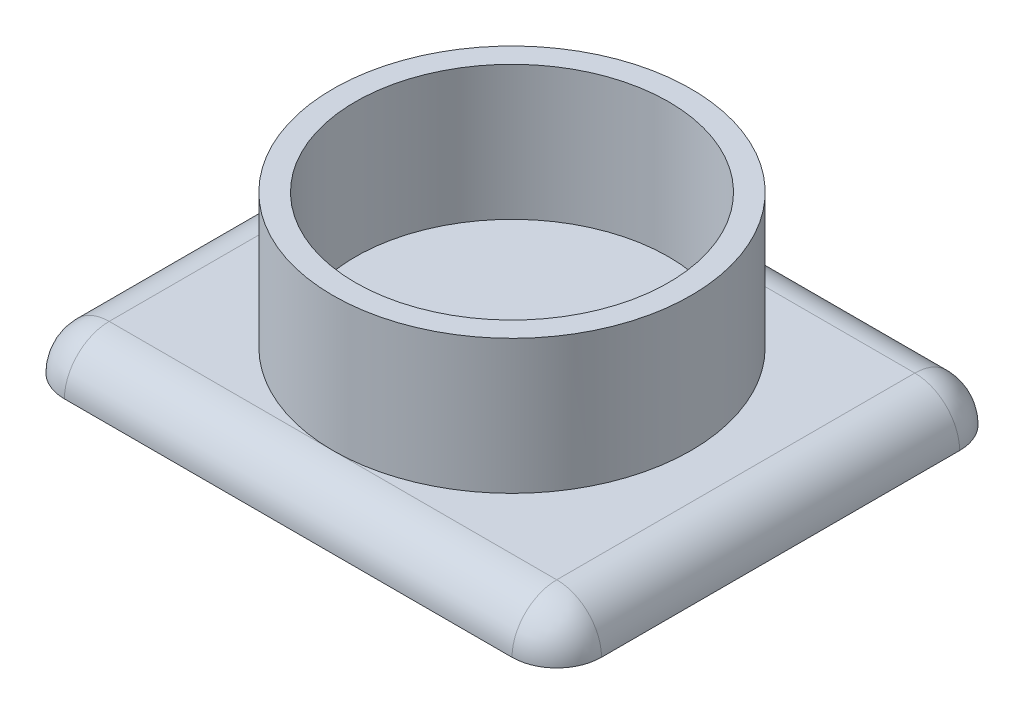
ISO-10303-21;
HEADER;
FILE_DESCRIPTION(('STEP AP214'),'2;1');
FILE_NAME('part.step','',(''),(''),'','','');
FILE_SCHEMA(('AUTOMOTIVE_DESIGN { 1 0 10303 214 1 1 1 1 }'));
ENDSEC;
DATA;
#1=APPLICATION_CONTEXT('core data for automotive mechanical design processes');
#2=APPLICATION_PROTOCOL_DEFINITION('international standard','automotive_design',2000,#1);
#3=PRODUCT_CONTEXT('',#1,'mechanical');
#4=PRODUCT('Part','Part','',(#3));
#5=PRODUCT_RELATED_PRODUCT_CATEGORY('part','',(#4));
#6=PRODUCT_DEFINITION_FORMATION('','',#4);
#7=PRODUCT_DEFINITION_CONTEXT('part definition',#1,'design');
#8=PRODUCT_DEFINITION('design','',#6,#7);
#9=PRODUCT_DEFINITION_SHAPE('','',#8);
#10=(LENGTH_UNIT() NAMED_UNIT(*) SI_UNIT(.MILLI.,.METRE.));
#11=(NAMED_UNIT(*) PLANE_ANGLE_UNIT() SI_UNIT($,.RADIAN.));
#12=(NAMED_UNIT(*) SI_UNIT($,.STERADIAN.) SOLID_ANGLE_UNIT());
#13=UNCERTAINTY_MEASURE_WITH_UNIT(LENGTH_MEASURE(1.E-05),#10,'distance_accuracy_value','');
#14=(GEOMETRIC_REPRESENTATION_CONTEXT(3) GLOBAL_UNCERTAINTY_ASSIGNED_CONTEXT((#13)) GLOBAL_UNIT_ASSIGNED_CONTEXT((#10,
#11,#12)) REPRESENTATION_CONTEXT('',''));
#15=CARTESIAN_POINT('',(0.,0.,0.));
#16=DIRECTION('',(0.,0.,1.));
#17=DIRECTION('',(1.,0.,0.));
#18=AXIS2_PLACEMENT_3D('',#15,#16,#17);
#19=CARTESIAN_POINT('',(0.,0.,0.));
#20=DIRECTION('',(0.,-1.,0.));
#21=DIRECTION('',(0.,0.,-1.));
#22=AXIS2_PLACEMENT_3D('',#19,#20,#21);
#23=PLANE('',#22);
#24=DIRECTION('',(0.,0.,1.));
#25=VECTOR('',#24,1.);
#26=CARTESIAN_POINT('',(50.,0.,0.));
#27=LINE('',#26,#25);
#28=CARTESIAN_POINT('',(50.,0.,40.));
#29=VERTEX_POINT('',#28);
#30=CARTESIAN_POINT('',(50.,0.,-40.));
#31=VERTEX_POINT('',#30);
#32=EDGE_CURVE('E124',#29,#31,#27,.F.);
#33=ORIENTED_EDGE('',*,*,#32,.T.);
#34=DIRECTION('',(-1.,0.,0.));
#35=VECTOR('',#34,1.);
#36=CARTESIAN_POINT('',(-50.,0.,-40.));
#37=LINE('',#36,#35);
#38=CARTESIAN_POINT('',(0.,0.,-40.));
#39=VERTEX_POINT('',#38);
#40=EDGE_CURVE('E11',#31,#39,#37,.T.);
#41=ORIENTED_EDGE('',*,*,#40,.T.);
#42=CARTESIAN_POINT('',(0.,0.,0.));
#43=DIRECTION('',(0.,1.,0.));
#44=DIRECTION('',(0.,0.,1.));
#45=AXIS2_PLACEMENT_3D('',#42,#43,#44);
#46=CIRCLE('',#45,40.);
#47=CARTESIAN_POINT('',(0.,0.,40.));
#48=VERTEX_POINT('',#47);
#49=EDGE_CURVE('E168',#48,#39,#46,.T.);
#50=ORIENTED_EDGE('',*,*,#49,.F.);
#51=DIRECTION('',(-1.,0.,0.));
#52=VECTOR('',#51,1.);
#53=CARTESIAN_POINT('',(0.,0.,40.));
#54=LINE('',#53,#52);
#55=EDGE_CURVE('E132',#48,#29,#54,.F.);
#56=ORIENTED_EDGE('',*,*,#55,.T.);
#57=EDGE_LOOP('',(#33,#41,#50,#56));
#58=FACE_BOUND('',#57,.T.);
#59=ADVANCED_FACE('F41',(#58),#23,.F.);
#60=CARTESIAN_POINT('',(0.,30.,0.));
#61=DIRECTION('',(0.,1.,0.));
#62=DIRECTION('',(0.,0.,1.));
#63=AXIS2_PLACEMENT_3D('',#60,#61,#62);
#64=PLANE('',#63);
#65=CARTESIAN_POINT('',(0.,30.,0.));
#66=DIRECTION('',(0.,1.,0.));
#67=DIRECTION('',(0.,0.,1.));
#68=AXIS2_PLACEMENT_3D('',#65,#66,#67);
#69=CIRCLE('',#68,40.);
#70=CARTESIAN_POINT('',(0.,30.,40.));
#71=VERTEX_POINT('',#70);
#72=EDGE_CURVE('E164',#71,#71,#69,.T.);
#73=ORIENTED_EDGE('',*,*,#72,.T.);
#74=EDGE_LOOP('',(#73));
#75=FACE_BOUND('',#74,.T.);
#76=CARTESIAN_POINT('',(0.,30.,0.));
#77=DIRECTION('',(0.,1.,0.));
#78=DIRECTION('',(0.,0.,1.));
#79=AXIS2_PLACEMENT_3D('',#76,#77,#78);
#80=CIRCLE('',#79,35.);
#81=CARTESIAN_POINT('',(0.,30.,35.));
#82=VERTEX_POINT('',#81);
#83=EDGE_CURVE('E161',#82,#82,#80,.T.);
#84=ORIENTED_EDGE('',*,*,#83,.F.);
#85=EDGE_LOOP('',(#84));
#86=FACE_BOUND('',#85,.T.);
#87=ADVANCED_FACE('F199',(#75,#86),#64,.T.);
#88=CARTESIAN_POINT('',(0.,30.,0.));
#89=DIRECTION('',(0.,-1.,0.));
#90=DIRECTION('',(0.,0.,-1.));
#91=AXIS2_PLACEMENT_3D('',#88,#89,#90);
#92=CYLINDRICAL_SURFACE('',#91,40.);
#93=ORIENTED_EDGE('',*,*,#72,.F.);
#94=EDGE_LOOP('',(#93));
#95=FACE_BOUND('',#94,.T.);
#96=ORIENTED_EDGE('',*,*,#49,.T.);
#97=EDGE_CURVE('E160',#39,#48,#46,.T.);
#98=ORIENTED_EDGE('',*,*,#97,.T.);
#99=EDGE_LOOP('',(#96,#98));
#100=FACE_BOUND('',#99,.T.);
#101=ADVANCED_FACE('F206',(#95,#100),#92,.T.);
#102=CARTESIAN_POINT('',(0.,30.,0.));
#103=DIRECTION('',(0.,-1.,0.));
#104=DIRECTION('',(0.,0.,-1.));
#105=AXIS2_PLACEMENT_3D('',#102,#103,#104);
#106=CYLINDRICAL_SURFACE('',#105,35.);
#107=ORIENTED_EDGE('',*,*,#83,.T.);
#108=EDGE_LOOP('',(#107));
#109=FACE_BOUND('',#108,.T.);
#110=CARTESIAN_POINT('',(0.,0.,0.));
#111=DIRECTION('',(0.,1.,0.));
#112=DIRECTION('',(0.,0.,1.));
#113=AXIS2_PLACEMENT_3D('',#110,#111,#112);
#114=CIRCLE('',#113,35.);
#115=CARTESIAN_POINT('',(0.,0.,35.));
#116=VERTEX_POINT('',#115);
#117=EDGE_CURVE('E165',#116,#116,#114,.T.);
#118=ORIENTED_EDGE('',*,*,#117,.F.);
#119=EDGE_LOOP('',(#118));
#120=FACE_BOUND('',#119,.T.);
#121=ADVANCED_FACE('F212',(#109,#120),#106,.F.);
#122=ORIENTED_EDGE('',*,*,#117,.T.);
#123=EDGE_LOOP('',(#122));
#124=FACE_BOUND('',#123,.T.);
#125=ADVANCED_FACE('F201',(#124),#23,.F.);
#126=CARTESIAN_POINT('',(0.,-10.,0.));
#127=DIRECTION('',(0.,-1.,0.));
#128=DIRECTION('',(0.,0.,-1.));
#129=AXIS2_PLACEMENT_3D('',#126,#127,#128);
#130=PLANE('',#129);
#131=DIRECTION('',(-1.,0.,0.));
#132=VECTOR('',#131,1.);
#133=CARTESIAN_POINT('',(60.,-10.,50.));
#134=LINE('',#133,#132);
#135=CARTESIAN_POINT('',(50.,-10.,50.));
#136=VERTEX_POINT('',#135);
#137=CARTESIAN_POINT('',(-50.,-10.,50.));
#138=VERTEX_POINT('',#137);
#139=EDGE_CURVE('E109',#136,#138,#134,.T.);
#140=ORIENTED_EDGE('',*,*,#139,.T.);
#141=CARTESIAN_POINT('',(-50.,-10.,40.));
#142=DIRECTION('',(0.,-1.,0.));
#143=DIRECTION('',(0.,0.,-1.));
#144=AXIS2_PLACEMENT_3D('',#141,#142,#143);
#145=CIRCLE('',#144,10.);
#146=CARTESIAN_POINT('',(-60.,-10.,40.));
#147=VERTEX_POINT('',#146);
#148=EDGE_CURVE('E105',#138,#147,#145,.T.);
#149=ORIENTED_EDGE('',*,*,#148,.T.);
#150=DIRECTION('',(0.,0.,1.));
#151=VECTOR('',#150,1.);
#152=CARTESIAN_POINT('',(-60.,-10.,-50.));
#153=LINE('',#152,#151);
#154=CARTESIAN_POINT('',(-60.,-10.,-40.));
#155=VERTEX_POINT('',#154);
#156=EDGE_CURVE('E98',#155,#147,#153,.T.);
#157=ORIENTED_EDGE('',*,*,#156,.F.);
#158=CARTESIAN_POINT('',(-50.,-10.,-40.));
#159=DIRECTION('',(0.,-1.,0.));
#160=DIRECTION('',(0.,0.,-1.));
#161=AXIS2_PLACEMENT_3D('',#158,#159,#160);
#162=CIRCLE('',#161,10.);
#163=CARTESIAN_POINT('',(-50.,-10.,-50.));
#164=VERTEX_POINT('',#163);
#165=EDGE_CURVE('E102',#155,#164,#162,.T.);
#166=ORIENTED_EDGE('',*,*,#165,.T.);
#167=DIRECTION('',(-1.,0.,0.));
#168=VECTOR('',#167,1.);
#169=CARTESIAN_POINT('',(60.,-10.,-50.));
#170=LINE('',#169,#168);
#171=CARTESIAN_POINT('',(50.,-10.,-50.));
#172=VERTEX_POINT('',#171);
#173=EDGE_CURVE('E108',#172,#164,#170,.T.);
#174=ORIENTED_EDGE('',*,*,#173,.F.);
#175=CARTESIAN_POINT('',(50.,-10.,-40.));
#176=DIRECTION('',(0.,-1.,0.));
#177=DIRECTION('',(0.,0.,-1.));
#178=AXIS2_PLACEMENT_3D('',#175,#176,#177);
#179=CIRCLE('',#178,10.);
#180=CARTESIAN_POINT('',(60.,-10.,-40.));
#181=VERTEX_POINT('',#180);
#182=EDGE_CURVE('E122',#172,#181,#179,.T.);
#183=ORIENTED_EDGE('',*,*,#182,.T.);
#184=DIRECTION('',(0.,0.,1.));
#185=VECTOR('',#184,1.);
#186=CARTESIAN_POINT('',(60.,-10.,-50.));
#187=LINE('',#186,#185);
#188=CARTESIAN_POINT('',(60.,-10.,40.));
#189=VERTEX_POINT('',#188);
#190=EDGE_CURVE('E150',#181,#189,#187,.T.);
#191=ORIENTED_EDGE('',*,*,#190,.T.);
#192=CARTESIAN_POINT('',(50.,-10.,40.));
#193=DIRECTION('',(0.,-1.,0.));
#194=DIRECTION('',(0.,0.,-1.));
#195=AXIS2_PLACEMENT_3D('',#192,#193,#194);
#196=CIRCLE('',#195,10.);
#197=EDGE_CURVE('E127',#189,#136,#196,.T.);
#198=ORIENTED_EDGE('',*,*,#197,.T.);
#199=EDGE_LOOP('',(#140,#149,#157,#166,#174,#183,#191,#198));
#200=FACE_BOUND('',#199,.T.);
#201=ADVANCED_FACE('F100',(#200),#130,.T.);
#202=ORIENTED_EDGE('',*,*,#97,.F.);
#203=DIRECTION('',(-1.,0.,0.));
#204=VECTOR('',#203,1.);
#205=CARTESIAN_POINT('',(-50.,0.,-40.));
#206=LINE('',#205,#204);
#207=CARTESIAN_POINT('',(-50.,0.,-40.));
#208=VERTEX_POINT('',#207);
#209=EDGE_CURVE('E50',#39,#208,#206,.T.);
#210=ORIENTED_EDGE('',*,*,#209,.T.);
#211=DIRECTION('',(0.,0.,1.));
#212=VECTOR('',#211,1.);
#213=CARTESIAN_POINT('',(-50.,0.,40.));
#214=LINE('',#213,#212);
#215=CARTESIAN_POINT('',(-50.,0.,40.));
#216=VERTEX_POINT('',#215);
#217=EDGE_CURVE('E61',#208,#216,#214,.T.);
#218=ORIENTED_EDGE('',*,*,#217,.T.);
#219=DIRECTION('',(-1.,0.,0.));
#220=VECTOR('',#219,1.);
#221=CARTESIAN_POINT('',(0.,0.,40.));
#222=LINE('',#221,#220);
#223=EDGE_CURVE('E134',#216,#48,#222,.F.);
#224=ORIENTED_EDGE('',*,*,#223,.T.);
#225=EDGE_LOOP('',(#202,#210,#218,#224));
#226=FACE_BOUND('',#225,.T.);
#227=ADVANCED_FACE('F202',(#226),#23,.F.);
#228=CARTESIAN_POINT('',(-50.,-10.,40.));
#229=DIRECTION('',(0.,-1.,0.));
#230=DIRECTION('',(0.,0.,-1.));
#231=AXIS2_PLACEMENT_3D('',#228,#229,#230);
#232=SPHERICAL_SURFACE('',#231,10.);
#233=CARTESIAN_POINT('',(-50.,-10.,40.));
#234=DIRECTION('',(0.,0.,-1.));
#235=DIRECTION('',(-1.,0.,0.));
#236=AXIS2_PLACEMENT_3D('',#233,#234,#235);
#237=CIRCLE('',#236,10.);
#238=EDGE_CURVE('E147',#147,#216,#237,.T.);
#239=ORIENTED_EDGE('',*,*,#238,.F.);
#240=ORIENTED_EDGE('',*,*,#148,.F.);
#241=CARTESIAN_POINT('',(-50.,-10.,40.));
#242=DIRECTION('',(1.,0.,0.));
#243=DIRECTION('',(0.,0.,-1.));
#244=AXIS2_PLACEMENT_3D('',#241,#242,#243);
#245=CIRCLE('',#244,10.);
#246=EDGE_CURVE('E45',#216,#138,#245,.T.);
#247=ORIENTED_EDGE('',*,*,#246,.F.);
#248=EDGE_LOOP('',(#239,#240,#247));
#249=FACE_BOUND('',#248,.T.);
#250=ADVANCED_FACE('F43',(#249),#232,.T.);
#251=CARTESIAN_POINT('',(60.,-10.,40.));
#252=DIRECTION('',(-1.,0.,0.));
#253=DIRECTION('',(0.,0.,1.));
#254=AXIS2_PLACEMENT_3D('',#251,#252,#253);
#255=CYLINDRICAL_SURFACE('',#254,10.);
#256=ORIENTED_EDGE('',*,*,#246,.T.);
#257=ORIENTED_EDGE('',*,*,#139,.F.);
#258=CARTESIAN_POINT('',(50.,-10.,40.));
#259=DIRECTION('',(1.,0.,0.));
#260=DIRECTION('',(0.,0.,-1.));
#261=AXIS2_PLACEMENT_3D('',#258,#259,#260);
#262=CIRCLE('',#261,10.);
#263=EDGE_CURVE('E116',#29,#136,#262,.T.);
#264=ORIENTED_EDGE('',*,*,#263,.F.);
#265=ORIENTED_EDGE('',*,*,#55,.F.);
#266=ORIENTED_EDGE('',*,*,#223,.F.);
#267=EDGE_LOOP('',(#256,#257,#264,#265,#266));
#268=FACE_BOUND('',#267,.T.);
#269=ADVANCED_FACE('F175',(#268),#255,.T.);
#270=CARTESIAN_POINT('',(-50.,-10.,0.));
#271=DIRECTION('',(0.,0.,-1.));
#272=DIRECTION('',(-1.,0.,0.));
#273=AXIS2_PLACEMENT_3D('',#270,#271,#272);
#274=CYLINDRICAL_SURFACE('',#273,10.);
#275=ORIENTED_EDGE('',*,*,#238,.T.);
#276=ORIENTED_EDGE('',*,*,#217,.F.);
#277=CARTESIAN_POINT('',(-50.,-10.,-40.));
#278=DIRECTION('',(0.,0.,-1.));
#279=DIRECTION('',(-1.,0.,0.));
#280=AXIS2_PLACEMENT_3D('',#277,#278,#279);
#281=CIRCLE('',#280,10.);
#282=EDGE_CURVE('E112',#155,#208,#281,.T.);
#283=ORIENTED_EDGE('',*,*,#282,.F.);
#284=ORIENTED_EDGE('',*,*,#156,.T.);
#285=EDGE_LOOP('',(#275,#276,#283,#284));
#286=FACE_BOUND('',#285,.T.);
#287=ADVANCED_FACE('F113',(#286),#274,.T.);
#288=CARTESIAN_POINT('',(50.,-10.,40.));
#289=DIRECTION('',(0.,-1.,0.));
#290=DIRECTION('',(0.,0.,-1.));
#291=AXIS2_PLACEMENT_3D('',#288,#289,#290);
#292=SPHERICAL_SURFACE('',#291,10.);
#293=ORIENTED_EDGE('',*,*,#263,.T.);
#294=ORIENTED_EDGE('',*,*,#197,.F.);
#295=CARTESIAN_POINT('',(50.,-10.,40.));
#296=DIRECTION('',(0.,0.,-1.));
#297=DIRECTION('',(-1.,0.,0.));
#298=AXIS2_PLACEMENT_3D('',#295,#296,#297);
#299=CIRCLE('',#298,10.);
#300=EDGE_CURVE('E117',#29,#189,#299,.T.);
#301=ORIENTED_EDGE('',*,*,#300,.F.);
#302=EDGE_LOOP('',(#293,#294,#301));
#303=FACE_BOUND('',#302,.T.);
#304=ADVANCED_FACE('F177',(#303),#292,.T.);
#305=CARTESIAN_POINT('',(-50.,-10.,-40.));
#306=DIRECTION('',(0.,-1.,0.));
#307=DIRECTION('',(0.,0.,-1.));
#308=AXIS2_PLACEMENT_3D('',#305,#306,#307);
#309=SPHERICAL_SURFACE('',#308,10.);
#310=ORIENTED_EDGE('',*,*,#165,.F.);
#311=ORIENTED_EDGE('',*,*,#282,.T.);
#312=CARTESIAN_POINT('',(-50.,-10.,-40.));
#313=DIRECTION('',(1.,0.,0.));
#314=DIRECTION('',(0.,0.,-1.));
#315=AXIS2_PLACEMENT_3D('',#312,#313,#314);
#316=CIRCLE('',#315,10.);
#317=EDGE_CURVE('E120',#164,#208,#316,.T.);
#318=ORIENTED_EDGE('',*,*,#317,.F.);
#319=EDGE_LOOP('',(#310,#311,#318));
#320=FACE_BOUND('',#319,.T.);
#321=ADVANCED_FACE('F119',(#320),#309,.T.);
#322=CARTESIAN_POINT('',(50.,-10.,-50.));
#323=DIRECTION('',(0.,0.,1.));
#324=DIRECTION('',(1.,0.,0.));
#325=AXIS2_PLACEMENT_3D('',#322,#323,#324);
#326=CYLINDRICAL_SURFACE('',#325,10.);
#327=ORIENTED_EDGE('',*,*,#300,.T.);
#328=ORIENTED_EDGE('',*,*,#190,.F.);
#329=CARTESIAN_POINT('',(50.,-10.,-40.));
#330=DIRECTION('',(0.,0.,-1.));
#331=DIRECTION('',(-1.,0.,0.));
#332=AXIS2_PLACEMENT_3D('',#329,#330,#331);
#333=CIRCLE('',#332,10.);
#334=EDGE_CURVE('E141',#31,#181,#333,.T.);
#335=ORIENTED_EDGE('',*,*,#334,.F.);
#336=ORIENTED_EDGE('',*,*,#32,.F.);
#337=EDGE_LOOP('',(#327,#328,#335,#336));
#338=FACE_BOUND('',#337,.T.);
#339=ADVANCED_FACE('F181',(#338),#326,.T.);
#340=CARTESIAN_POINT('',(0.,-10.,-40.));
#341=DIRECTION('',(1.,0.,0.));
#342=DIRECTION('',(0.,0.,-1.));
#343=AXIS2_PLACEMENT_3D('',#340,#341,#342);
#344=CYLINDRICAL_SURFACE('',#343,10.);
#345=ORIENTED_EDGE('',*,*,#209,.F.);
#346=ORIENTED_EDGE('',*,*,#40,.F.);
#347=CARTESIAN_POINT('',(50.,-10.,-40.));
#348=DIRECTION('',(1.,0.,0.));
#349=DIRECTION('',(0.,0.,-1.));
#350=AXIS2_PLACEMENT_3D('',#347,#348,#349);
#351=CIRCLE('',#350,10.);
#352=EDGE_CURVE('E138',#172,#31,#351,.T.);
#353=ORIENTED_EDGE('',*,*,#352,.F.);
#354=ORIENTED_EDGE('',*,*,#173,.T.);
#355=ORIENTED_EDGE('',*,*,#317,.T.);
#356=EDGE_LOOP('',(#345,#346,#353,#354,#355));
#357=FACE_BOUND('',#356,.T.);
#358=ADVANCED_FACE('F187',(#357),#344,.T.);
#359=CARTESIAN_POINT('',(50.,-10.,-40.));
#360=DIRECTION('',(0.,-1.,0.));
#361=DIRECTION('',(0.,0.,-1.));
#362=AXIS2_PLACEMENT_3D('',#359,#360,#361);
#363=SPHERICAL_SURFACE('',#362,10.);
#364=ORIENTED_EDGE('',*,*,#334,.T.);
#365=ORIENTED_EDGE('',*,*,#182,.F.);
#366=ORIENTED_EDGE('',*,*,#352,.T.);
#367=EDGE_LOOP('',(#364,#365,#366));
#368=FACE_BOUND('',#367,.T.);
#369=ADVANCED_FACE('F190',(#368),#363,.T.);
#370=CLOSED_SHELL('',(#59,#87,#101,#121,#125,#201,#227,#250,#269,#287,#304,#321,#339,#358,#369));
#371=MANIFOLD_SOLID_BREP('B2',#370);
#372=ADVANCED_BREP_SHAPE_REPRESENTATION('',(#18,#371),#14);
#373=SHAPE_DEFINITION_REPRESENTATION(#9,#372);
ENDSEC;
END-ISO-10303-21;
